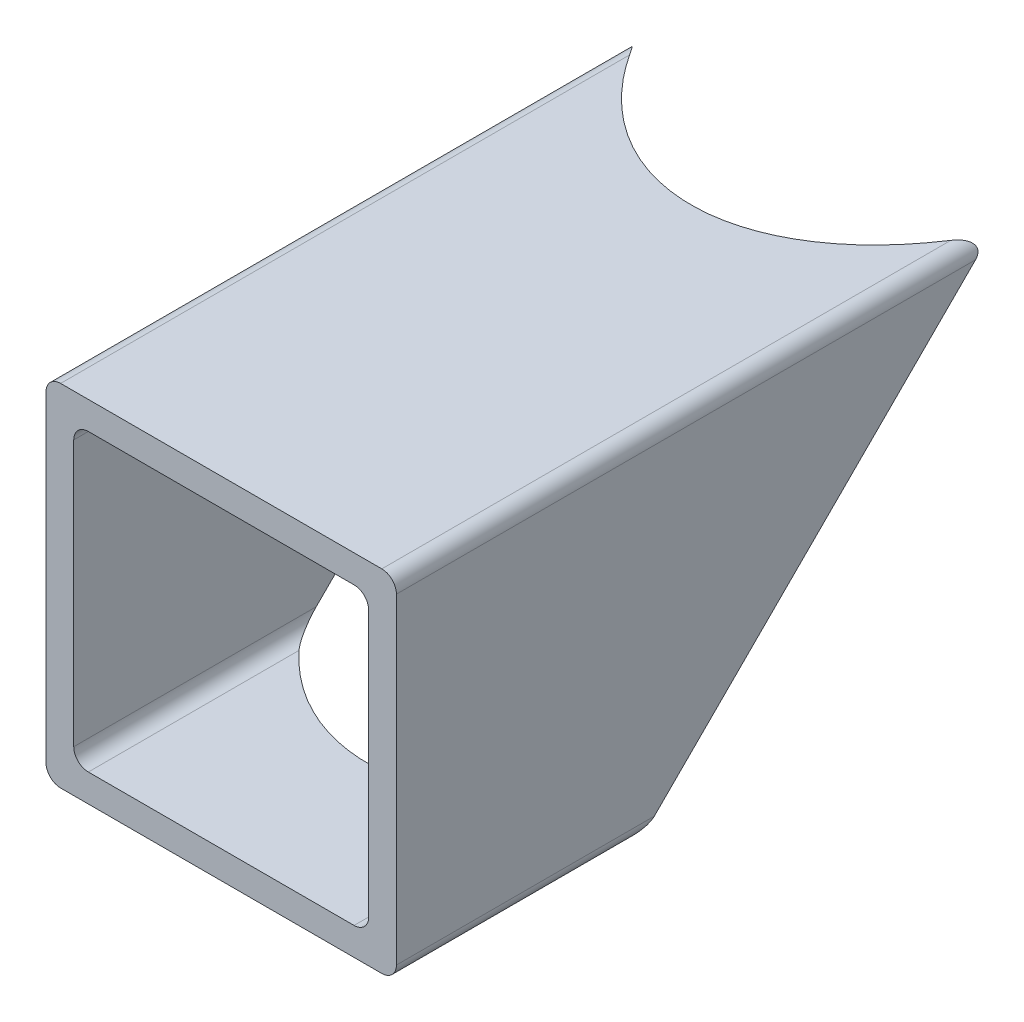
ISO-10303-21;
HEADER;
FILE_DESCRIPTION(('STEP AP214'),'2;1');
FILE_NAME('part.step','',(''),(''),'','','');
FILE_SCHEMA(('AUTOMOTIVE_DESIGN { 1 0 10303 214 1 1 1 1 }'));
ENDSEC;
DATA;
#1=APPLICATION_CONTEXT('core data for automotive mechanical design processes');
#2=APPLICATION_PROTOCOL_DEFINITION('international standard','automotive_design',2000,#1);
#3=PRODUCT_CONTEXT('',#1,'mechanical');
#4=PRODUCT('Part','Part','',(#3));
#5=PRODUCT_RELATED_PRODUCT_CATEGORY('part','',(#4));
#6=PRODUCT_DEFINITION_FORMATION('','',#4);
#7=PRODUCT_DEFINITION_CONTEXT('part definition',#1,'design');
#8=PRODUCT_DEFINITION('design','',#6,#7);
#9=PRODUCT_DEFINITION_SHAPE('','',#8);
#10=(LENGTH_UNIT() NAMED_UNIT(*) SI_UNIT(.MILLI.,.METRE.));
#11=(NAMED_UNIT(*) PLANE_ANGLE_UNIT() SI_UNIT($,.RADIAN.));
#12=(NAMED_UNIT(*) SI_UNIT($,.STERADIAN.) SOLID_ANGLE_UNIT());
#13=UNCERTAINTY_MEASURE_WITH_UNIT(LENGTH_MEASURE(1.E-05),#10,'distance_accuracy_value','');
#14=(GEOMETRIC_REPRESENTATION_CONTEXT(3) GLOBAL_UNCERTAINTY_ASSIGNED_CONTEXT((#13)) GLOBAL_UNIT_ASSIGNED_CONTEXT((#10,
#11,#12)) REPRESENTATION_CONTEXT('',''));
#15=CARTESIAN_POINT('',(0.,0.,0.));
#16=DIRECTION('',(0.,0.,1.));
#17=DIRECTION('',(1.,0.,0.));
#18=AXIS2_PLACEMENT_3D('',#15,#16,#17);
#19=CARTESIAN_POINT('',(-13.97,-13.97,50.8));
#20=DIRECTION('',(0.,0.,-1.));
#21=DIRECTION('',(-1.,0.,0.));
#22=AXIS2_PLACEMENT_3D('',#19,#20,#21);
#23=PLANE('',#22);
#24=CARTESIAN_POINT('',(-13.97,-13.97,50.8));
#25=DIRECTION('',(0.,0.,1.));
#26=DIRECTION('',(-1.,0.,0.));
#27=AXIS2_PLACEMENT_3D('',#24,#25,#26);
#28=CIRCLE('',#27,1.27);
#29=CARTESIAN_POINT('',(-15.24,-13.97,50.8));
#30=VERTEX_POINT('',#29);
#31=CARTESIAN_POINT('',(-13.97,-15.24,50.8));
#32=VERTEX_POINT('',#31);
#33=EDGE_CURVE('E210',#30,#32,#28,.T.);
#34=ORIENTED_EDGE('',*,*,#33,.T.);
#35=DIRECTION('',(1.,0.,0.));
#36=VECTOR('',#35,1.);
#37=CARTESIAN_POINT('',(-13.97,-15.24,50.8));
#38=LINE('',#37,#36);
#39=CARTESIAN_POINT('',(13.97,-15.24,50.8));
#40=VERTEX_POINT('',#39);
#41=EDGE_CURVE('E214',#32,#40,#38,.T.);
#42=ORIENTED_EDGE('',*,*,#41,.T.);
#43=CARTESIAN_POINT('',(13.97,-13.97,50.8));
#44=DIRECTION('',(0.,0.,1.));
#45=DIRECTION('',(1.,0.,0.));
#46=AXIS2_PLACEMENT_3D('',#43,#44,#45);
#47=CIRCLE('',#46,1.27);
#48=CARTESIAN_POINT('',(15.24,-13.97,50.8));
#49=VERTEX_POINT('',#48);
#50=EDGE_CURVE('E217',#40,#49,#47,.T.);
#51=ORIENTED_EDGE('',*,*,#50,.T.);
#52=DIRECTION('',(0.,1.,0.));
#53=VECTOR('',#52,1.);
#54=CARTESIAN_POINT('',(15.24,-13.97,50.8));
#55=LINE('',#54,#53);
#56=CARTESIAN_POINT('',(15.24,13.97,50.8));
#57=VERTEX_POINT('',#56);
#58=EDGE_CURVE('E220',#49,#57,#55,.T.);
#59=ORIENTED_EDGE('',*,*,#58,.T.);
#60=CARTESIAN_POINT('',(13.97,13.97,50.8));
#61=DIRECTION('',(0.,0.,1.));
#62=DIRECTION('',(-1.,0.,0.));
#63=AXIS2_PLACEMENT_3D('',#60,#61,#62);
#64=CIRCLE('',#63,1.27);
#65=CARTESIAN_POINT('',(13.97,15.24,50.8));
#66=VERTEX_POINT('',#65);
#67=EDGE_CURVE('E223',#57,#66,#64,.T.);
#68=ORIENTED_EDGE('',*,*,#67,.T.);
#69=DIRECTION('',(-1.,0.,0.));
#70=VECTOR('',#69,1.);
#71=CARTESIAN_POINT('',(-13.97,15.24,50.8));
#72=LINE('',#71,#70);
#73=CARTESIAN_POINT('',(-13.97,15.24,50.8));
#74=VERTEX_POINT('',#73);
#75=EDGE_CURVE('E226',#66,#74,#72,.T.);
#76=ORIENTED_EDGE('',*,*,#75,.T.);
#77=CARTESIAN_POINT('',(-13.97,13.97,50.8));
#78=DIRECTION('',(0.,0.,1.));
#79=DIRECTION('',(-1.,0.,0.));
#80=AXIS2_PLACEMENT_3D('',#77,#78,#79);
#81=CIRCLE('',#80,1.27);
#82=CARTESIAN_POINT('',(-15.24,13.97,50.8));
#83=VERTEX_POINT('',#82);
#84=EDGE_CURVE('E229',#74,#83,#81,.T.);
#85=ORIENTED_EDGE('',*,*,#84,.T.);
#86=DIRECTION('',(0.,-1.,0.));
#87=VECTOR('',#86,1.);
#88=CARTESIAN_POINT('',(-15.24,-13.97,50.8));
#89=LINE('',#88,#87);
#90=EDGE_CURVE('E232',#83,#30,#89,.T.);
#91=ORIENTED_EDGE('',*,*,#90,.T.);
#92=EDGE_LOOP('',(#34,#42,#51,#59,#68,#76,#85,#91));
#93=FACE_BOUND('',#92,.T.);
#94=CARTESIAN_POINT('',(-11.557,11.557,50.8));
#95=DIRECTION('',(0.,0.,1.));
#96=DIRECTION('',(-1.,0.,0.));
#97=AXIS2_PLACEMENT_3D('',#94,#95,#96);
#98=CIRCLE('',#97,1.27);
#99=CARTESIAN_POINT('',(-11.557,12.827,50.8));
#100=VERTEX_POINT('',#99);
#101=CARTESIAN_POINT('',(-12.827,11.557,50.8));
#102=VERTEX_POINT('',#101);
#103=EDGE_CURVE('E274',#100,#102,#98,.T.);
#104=ORIENTED_EDGE('',*,*,#103,.F.);
#105=DIRECTION('',(-1.,0.,0.));
#106=VECTOR('',#105,1.);
#107=CARTESIAN_POINT('',(-11.557,12.827,50.8));
#108=LINE('',#107,#106);
#109=CARTESIAN_POINT('',(11.557,12.827,50.8));
#110=VERTEX_POINT('',#109);
#111=EDGE_CURVE('E177',#110,#100,#108,.T.);
#112=ORIENTED_EDGE('',*,*,#111,.F.);
#113=CARTESIAN_POINT('',(11.557,11.557,50.8));
#114=DIRECTION('',(0.,0.,1.));
#115=DIRECTION('',(-1.,0.,0.));
#116=AXIS2_PLACEMENT_3D('',#113,#114,#115);
#117=CIRCLE('',#116,1.27);
#118=CARTESIAN_POINT('',(12.827,11.557,50.8));
#119=VERTEX_POINT('',#118);
#120=EDGE_CURVE('E185',#119,#110,#117,.T.);
#121=ORIENTED_EDGE('',*,*,#120,.F.);
#122=DIRECTION('',(0.,1.,0.));
#123=VECTOR('',#122,1.);
#124=CARTESIAN_POINT('',(12.827,-11.557,50.8));
#125=LINE('',#124,#123);
#126=CARTESIAN_POINT('',(12.827,-11.557,50.8));
#127=VERTEX_POINT('',#126);
#128=EDGE_CURVE('E430',#127,#119,#125,.T.);
#129=ORIENTED_EDGE('',*,*,#128,.F.);
#130=CARTESIAN_POINT('',(11.557,-11.557,50.8));
#131=DIRECTION('',(0.,0.,1.));
#132=DIRECTION('',(1.,0.,0.));
#133=AXIS2_PLACEMENT_3D('',#130,#131,#132);
#134=CIRCLE('',#133,1.27);
#135=CARTESIAN_POINT('',(11.557,-12.827,50.8));
#136=VERTEX_POINT('',#135);
#137=EDGE_CURVE('E433',#136,#127,#134,.T.);
#138=ORIENTED_EDGE('',*,*,#137,.F.);
#139=DIRECTION('',(1.,0.,0.));
#140=VECTOR('',#139,1.);
#141=CARTESIAN_POINT('',(-11.557,-12.827,50.8));
#142=LINE('',#141,#140);
#143=CARTESIAN_POINT('',(-11.557,-12.827,50.8));
#144=VERTEX_POINT('',#143);
#145=EDGE_CURVE('E437',#144,#136,#142,.T.);
#146=ORIENTED_EDGE('',*,*,#145,.F.);
#147=CARTESIAN_POINT('',(-11.557,-11.557,50.8));
#148=DIRECTION('',(0.,0.,1.));
#149=DIRECTION('',(-1.,0.,0.));
#150=AXIS2_PLACEMENT_3D('',#147,#148,#149);
#151=CIRCLE('',#150,1.27);
#152=CARTESIAN_POINT('',(-12.827,-11.557,50.8));
#153=VERTEX_POINT('',#152);
#154=EDGE_CURVE('E442',#153,#144,#151,.T.);
#155=ORIENTED_EDGE('',*,*,#154,.F.);
#156=DIRECTION('',(0.,-1.,0.));
#157=VECTOR('',#156,1.);
#158=CARTESIAN_POINT('',(-12.827,-11.557,50.8));
#159=LINE('',#158,#157);
#160=EDGE_CURVE('E278',#102,#153,#159,.T.);
#161=ORIENTED_EDGE('',*,*,#160,.F.);
#162=EDGE_LOOP('',(#104,#112,#121,#129,#138,#146,#155,#161));
#163=FACE_BOUND('',#162,.T.);
#164=ADVANCED_FACE('F45',(#93,#163),#23,.F.);
#165=CARTESIAN_POINT('',(-13.97,-13.97,50.8));
#166=DIRECTION('',(0.,0.,-1.));
#167=DIRECTION('',(-1.,0.,0.));
#168=AXIS2_PLACEMENT_3D('',#165,#166,#167);
#169=CYLINDRICAL_SURFACE('',#168,1.27);
#170=DIRECTION('',(0.,0.,-1.));
#171=VECTOR('',#170,1.);
#172=CARTESIAN_POINT('',(-15.24,-13.97,50.8));
#173=LINE('',#172,#171);
#174=CARTESIAN_POINT('',(-15.24,-13.97,28.3648451995282));
#175=VERTEX_POINT('',#174);
#176=EDGE_CURVE('E235',#30,#175,#173,.T.);
#177=ORIENTED_EDGE('',*,*,#176,.T.);
#178=CARTESIAN_POINT('',(-15.24,-13.97,28.3648451995282));
#179=CARTESIAN_POINT('',(-15.2399597933128,-14.0082625207357,28.4031806606299));
#180=CARTESIAN_POINT('',(-15.2382715238255,-14.04490144782,28.4430063442145));
#181=CARTESIAN_POINT('',(-15.2321714236056,-14.1152311687817,28.5248297774832));
#182=CARTESIAN_POINT('',(-15.2277663171047,-14.1489290075812,28.566821930692));
#183=CARTESIAN_POINT('',(-15.2168485300943,-14.2135691474092,28.6519821466976));
#184=CARTESIAN_POINT('',(-15.2103551137751,-14.2445334589871,28.6951362786126));
#185=CARTESIAN_POINT('',(-15.1955833749476,-14.3043568218791,28.7826268570673));
#186=CARTESIAN_POINT('',(-15.1873035662474,-14.3332140933194,28.8269642609535));
#187=CARTESIAN_POINT('',(-15.1580254222917,-14.4236944931634,28.9720369696088));
#188=CARTESIAN_POINT('',(-15.1339903259873,-14.4815605681103,29.0745107023465));
#189=CARTESIAN_POINT('',(-15.0801415732882,-14.5897767297412,29.2818613963164));
#190=CARTESIAN_POINT('',(-15.0503238387798,-14.6401214674997,29.3867400072517));
#191=CARTESIAN_POINT('',(-14.9855008644373,-14.7348416357365,29.5989306658683));
#192=CARTESIAN_POINT('',(-14.9504465766401,-14.7791521035202,29.7062565712552));
#193=CARTESIAN_POINT('',(-14.8758722505699,-14.8618479798902,29.9216421395505));
#194=CARTESIAN_POINT('',(-14.8363513837387,-14.9002322860284,30.0297019350909));
#195=CARTESIAN_POINT('',(-14.74734928766,-14.9762348883108,30.2608762247059));
#196=CARTESIAN_POINT('',(-14.6972453484167,-15.0130266093757,30.3840234940065));
#197=CARTESIAN_POINT('',(-14.5915148848506,-15.0792851324877,30.630006221175));
#198=CARTESIAN_POINT('',(-14.5358855246031,-15.1087481456037,30.7528414853907));
#199=CARTESIAN_POINT('',(-14.4192617860284,-15.1595723061417,30.9965113078229));
#200=CARTESIAN_POINT('',(-14.3583095096677,-15.1809909933737,31.1173539243881));
#201=CARTESIAN_POINT('',(-14.2301660321074,-15.2148346207996,31.3569060681196));
#202=CARTESIAN_POINT('',(-14.1629821125247,-15.2272699122726,31.475617896154));
#203=CARTESIAN_POINT('',(-14.0724476799731,-15.2360152718066,31.6251205591627));
#204=CARTESIAN_POINT('',(-14.0523892316306,-15.2374882363207,31.657636677661));
#205=CARTESIAN_POINT('',(-14.0116584410891,-15.2394808563908,31.7223627340123));
#206=CARTESIAN_POINT('',(-13.9909854269929,-15.2399994264151,31.7545722818153));
#207=CARTESIAN_POINT('',(-13.97,-15.24,31.7865846609608));
#208=B_SPLINE_CURVE_WITH_KNOTS('',3,(#178,#179,#180,#181,#182,#183,#184,#185,#186,#187,#188,
#189,#190,#191,#192,#193,#194,#195,#196,#197,#198,#199,#200,#201,#202,#203,#204,#205,#206,#207),
.UNSPECIFIED.,.F.,.F.,(4,2,2,2,2,2,2,2,2,2,2,2,2,2,4),(0.,0.162287984781081,0.324175906209731,
0.484611336670431,0.645180759888944,1.00492153309957,1.36491693646875,1.72852442534908,
2.09219947509691,2.50573656284833,2.91948700635604,3.33021889048948,3.74047674326324,
3.85516316641701,3.96997995387947),.UNSPECIFIED.);
#209=CARTESIAN_POINT('',(-13.97,-15.24,31.7865846609609));
#210=VERTEX_POINT('',#209);
#211=EDGE_CURVE('E62',#175,#210,#208,.T.);
#212=ORIENTED_EDGE('',*,*,#211,.T.);
#213=DIRECTION('',(0.,0.,-1.));
#214=VECTOR('',#213,1.);
#215=CARTESIAN_POINT('',(-13.97,-15.24,50.8));
#216=LINE('',#215,#214);
#217=EDGE_CURVE('E55',#32,#210,#216,.T.);
#218=ORIENTED_EDGE('',*,*,#217,.F.);
#219=ORIENTED_EDGE('',*,*,#33,.F.);
#220=EDGE_LOOP('',(#177,#212,#218,#219));
#221=FACE_BOUND('',#220,.T.);
#222=ADVANCED_FACE('F47',(#221),#169,.T.);
#223=CARTESIAN_POINT('',(-13.97,-15.24,50.8));
#224=DIRECTION('',(0.,1.,0.));
#225=DIRECTION('',(0.,0.,1.));
#226=AXIS2_PLACEMENT_3D('',#223,#224,#225);
#227=PLANE('',#226);
#228=ORIENTED_EDGE('',*,*,#217,.T.);
#229=CARTESIAN_POINT('',(0.,-15.24,13.4703841816037));
#230=DIRECTION('',(0.,1.,0.));
#231=DIRECTION('',(0.,0.,-1.));
#232=AXIS2_PLACEMENT_3D('',#229,#230,#231);
#233=ELLIPSE('',#232,26.9407683632075,19.05);
#234=CARTESIAN_POINT('',(13.97,-15.24,31.7865846609608));
#235=VERTEX_POINT('',#234);
#236=EDGE_CURVE('E269',#210,#235,#233,.T.);
#237=ORIENTED_EDGE('',*,*,#236,.T.);
#238=DIRECTION('',(0.,0.,-1.));
#239=VECTOR('',#238,1.);
#240=CARTESIAN_POINT('',(13.97,-15.24,50.8));
#241=LINE('',#240,#239);
#242=EDGE_CURVE('E259',#40,#235,#241,.T.);
#243=ORIENTED_EDGE('',*,*,#242,.F.);
#244=ORIENTED_EDGE('',*,*,#41,.F.);
#245=EDGE_LOOP('',(#228,#237,#243,#244));
#246=FACE_BOUND('',#245,.T.);
#247=ADVANCED_FACE('F267',(#246),#227,.F.);
#248=CARTESIAN_POINT('',(13.97,-13.97,50.8));
#249=DIRECTION('',(0.,0.,-1.));
#250=DIRECTION('',(-1.,0.,0.));
#251=AXIS2_PLACEMENT_3D('',#248,#249,#250);
#252=CYLINDRICAL_SURFACE('',#251,1.27);
#253=ORIENTED_EDGE('',*,*,#242,.T.);
#254=CARTESIAN_POINT('',(13.97,-15.24,31.7865846609608));
#255=CARTESIAN_POINT('',(14.0065290762244,-15.2399806952168,31.730840496028));
#256=CARTESIAN_POINT('',(14.0421254939304,-15.2384241832387,31.6745138504665));
#257=CARTESIAN_POINT('',(14.1115614412475,-15.2325712509416,31.5609663396746));
#258=CARTESIAN_POINT('',(14.1454019238778,-15.2282763340509,31.5037459819117));
#259=CARTESIAN_POINT('',(14.2114183950377,-15.2172896373316,31.3887173865096));
#260=CARTESIAN_POINT('',(14.2435970998793,-15.2106019204198,31.3309103057987));
#261=CARTESIAN_POINT('',(14.3064518111961,-15.1950501893631,31.2147676476418));
#262=CARTESIAN_POINT('',(14.3371275682752,-15.1861858154854,31.1564319843742));
#263=CARTESIAN_POINT('',(14.4283687304961,-15.1561572045208,30.9782093373603));
#264=CARTESIAN_POINT('',(14.4866795449666,-15.1318180144499,30.8576886081662));
#265=CARTESIAN_POINT('',(14.5978326083327,-15.0757119029625,30.615814823344));
#266=CARTESIAN_POINT('',(14.6506718427174,-15.0439409181559,30.4944613477654));
#267=CARTESIAN_POINT('',(14.752837688537,-14.9720515763253,30.247256385929));
#268=CARTESIAN_POINT('',(14.8019704384879,-14.9316747790258,30.121399625895));
#269=CARTESIAN_POINT('',(14.8944219339882,-14.8431783035134,29.8702369894594));
#270=CARTESIAN_POINT('',(14.9377393887235,-14.7950569114372,29.7449312413158));
#271=CARTESIAN_POINT('',(15.0175588176793,-14.6909616547963,29.4972040190317));
#272=CARTESIAN_POINT('',(15.0541342633878,-14.6350857258766,29.374765949615));
#273=CARTESIAN_POINT('',(15.103404208826,-14.5440004585481,29.1933010921417));
#274=CARTESIAN_POINT('',(15.1188923849296,-14.5124349456899,29.1331918262324));
#275=CARTESIAN_POINT('',(15.1477402046985,-14.4465747657175,29.0139739134378));
#276=CARTESIAN_POINT('',(15.1611005058341,-14.4122809465246,28.9548649625401));
#277=CARTESIAN_POINT('',(15.182961351408,-14.3475612684423,28.8494202055626));
#278=CARTESIAN_POINT('',(15.1919015651048,-14.3176840325198,28.8028400139231));
#279=CARTESIAN_POINT('',(15.2078686859214,-14.2556644661392,28.7109310549519));
#280=CARTESIAN_POINT('',(15.2148973845535,-14.2235242923754,28.6656011518851));
#281=CARTESIAN_POINT('',(15.2267165830087,-14.1563935902849,28.5762622055116));
#282=CARTESIAN_POINT('',(15.2314913196524,-14.1213849401966,28.5322644217688));
#283=CARTESIAN_POINT('',(15.2381133607929,-14.0481798717443,28.4465831104398));
#284=CARTESIAN_POINT('',(15.2399526335068,-14.0099750073185,28.4049062324095));
#285=CARTESIAN_POINT('',(15.2400000000004,-13.9700000000005,28.364845199528));
#286=B_SPLINE_CURVE_WITH_KNOTS('',3,(#254,#255,#256,#257,#258,#259,#260,#261,#262,#263,#264,
#265,#266,#267,#268,#269,#270,#271,#272,#273,#274,#275,#276,#277,#278,#279,#280,#281,#282,#283,
#284,#285),.UNSPECIFIED.,.F.,.F.,(4,2,2,2,2,2,2,2,2,2,2,2,2,2,2,4),(0.,0.199878931316031,
0.399648220267438,0.599079903128122,0.798544567970603,1.20639488593044,1.61446872253378,
2.03717333516017,2.45997162043096,2.87784792501179,3.08668952134157,3.29546646413904,
3.4635571090219,3.63148966861092,3.80057988206464,3.97013195840712),.UNSPECIFIED.);
#287=CARTESIAN_POINT('',(15.24,-13.97,28.3648451995282));
#288=VERTEX_POINT('',#287);
#289=EDGE_CURVE('E280',#235,#288,#286,.T.);
#290=ORIENTED_EDGE('',*,*,#289,.T.);
#291=DIRECTION('',(0.,0.,-1.));
#292=VECTOR('',#291,1.);
#293=CARTESIAN_POINT('',(15.24,-13.97,50.8));
#294=LINE('',#293,#292);
#295=EDGE_CURVE('E255',#49,#288,#294,.T.);
#296=ORIENTED_EDGE('',*,*,#295,.F.);
#297=ORIENTED_EDGE('',*,*,#50,.F.);
#298=EDGE_LOOP('',(#253,#290,#296,#297));
#299=FACE_BOUND('',#298,.T.);
#300=ADVANCED_FACE('F352',(#299),#252,.T.);
#301=CARTESIAN_POINT('',(15.24,-13.97,50.8));
#302=DIRECTION('',(-1.,0.,0.));
#303=DIRECTION('',(0.,0.,1.));
#304=AXIS2_PLACEMENT_3D('',#301,#302,#303);
#305=PLANE('',#304);
#306=ORIENTED_EDGE('',*,*,#295,.T.);
#307=DIRECTION('',(0.,0.707106781186546,-0.707106781186549));
#308=VECTOR('',#307,1.);
#309=CARTESIAN_POINT('',(15.24,-25.8225774002359,40.2174225997642));
#310=LINE('',#309,#308);
#311=CARTESIAN_POINT('',(15.24,13.97,0.424845199528151));
#312=VERTEX_POINT('',#311);
#313=EDGE_CURVE('E351',#288,#312,#310,.T.);
#314=ORIENTED_EDGE('',*,*,#313,.T.);
#315=DIRECTION('',(0.,0.,-1.));
#316=VECTOR('',#315,1.);
#317=CARTESIAN_POINT('',(15.24,13.97,50.8));
#318=LINE('',#317,#316);
#319=EDGE_CURVE('E251',#57,#312,#318,.T.);
#320=ORIENTED_EDGE('',*,*,#319,.F.);
#321=ORIENTED_EDGE('',*,*,#58,.F.);
#322=EDGE_LOOP('',(#306,#314,#320,#321));
#323=FACE_BOUND('',#322,.T.);
#324=ADVANCED_FACE('F356',(#323),#305,.F.);
#325=CARTESIAN_POINT('',(13.97,13.97,50.8));
#326=DIRECTION('',(0.,0.,-1.));
#327=DIRECTION('',(-1.,0.,0.));
#328=AXIS2_PLACEMENT_3D('',#325,#326,#327);
#329=CYLINDRICAL_SURFACE('',#328,1.27);
#330=ORIENTED_EDGE('',*,*,#319,.T.);
#331=CARTESIAN_POINT('',(15.24,13.97,0.424845199528151));
#332=CARTESIAN_POINT('',(15.2399676772554,14.0030580280685,0.391840589170646));
#333=CARTESIAN_POINT('',(15.2387055541065,14.0374035921171,0.359881383859996));
#334=CARTESIAN_POINT('',(15.2328553173673,14.1094806076604,0.298831717975095));
#335=CARTESIAN_POINT('',(15.2281995856808,14.1472670154024,0.26981345374826));
#336=CARTESIAN_POINT('',(15.2145746481415,14.2260009565652,0.216683739828067));
#337=CARTESIAN_POINT('',(15.2055714859659,14.2669712076474,0.192613080736757));
#338=CARTESIAN_POINT('',(15.1823064912551,14.3508885445766,0.152199228998776));
#339=CARTESIAN_POINT('',(15.1680919216372,14.3938149172998,0.135789508571399));
#340=CARTESIAN_POINT('',(15.1394183860338,14.4663524008863,0.116454880243763));
#341=CARTESIAN_POINT('',(15.1264700611795,14.4958636684764,0.110902704493998));
#342=CARTESIAN_POINT('',(15.0980984452387,14.5542474687677,0.104798604378286));
#343=CARTESIAN_POINT('',(15.0826736688606,14.5831196062405,0.104249692286439));
#344=CARTESIAN_POINT('',(15.049836757142,14.6392602246224,0.108122992540109));
#345=CARTESIAN_POINT('',(15.0324289453603,14.6665320051131,0.112534569262359));
#346=CARTESIAN_POINT('',(14.9961677411691,14.7189312024157,0.125803651610084));
#347=CARTESIAN_POINT('',(14.9773134920687,14.7440573295004,0.134663809520228));
#348=CARTESIAN_POINT('',(14.9305029741956,14.8020147895149,0.160646021218692));
#349=CARTESIAN_POINT('',(14.9020740384156,14.8336018883234,0.179677952231376));
#350=CARTESIAN_POINT('',(14.8444493231867,14.8919157902864,0.223193616150866));
#351=CARTESIAN_POINT('',(14.8152519654721,14.9186315229998,0.247689492300282));
#352=CARTESIAN_POINT('',(14.7375767621054,14.9837689767054,0.317772240889159));
#353=CARTESIAN_POINT('',(14.6889730113795,15.0184253740807,0.366678034812447));
#354=CARTESIAN_POINT('',(14.5923432547486,15.0785333163203,0.470730769121807));
#355=CARTESIAN_POINT('',(14.5443233269007,15.1039214337015,0.525917444880577));
#356=CARTESIAN_POINT('',(14.4498748504733,15.1469802405767,0.639534565912577));
#357=CARTESIAN_POINT('',(14.4034359558244,15.1647174707145,0.697931847912596));
#358=CARTESIAN_POINT('',(14.3117409856235,15.1941047028279,0.81724952996219));
#359=CARTESIAN_POINT('',(14.2664870707712,15.2057442332985,0.878174077744335));
#360=CARTESIAN_POINT('',(14.1785887906798,15.2235327713959,0.999869780810549));
#361=CARTESIAN_POINT('',(14.1359068248215,15.2298335294287,1.06059250654504));
#362=CARTESIAN_POINT('',(14.0519447370921,15.2380449842418,1.18295318399597));
#363=CARTESIAN_POINT('',(14.0106598427039,15.2399725220264,1.24458670162347));
#364=CARTESIAN_POINT('',(13.97,15.24,1.30658466096074));
#365=B_SPLINE_CURVE_WITH_KNOTS('',3,(#331,#332,#333,#334,#335,#336,#337,#338,#339,#340,#341,
#342,#343,#344,#345,#346,#347,#348,#349,#350,#351,#352,#353,#354,#355,#356,#357,#358,#359,#360,
#361,#362,#363,#364),.UNSPECIFIED.,.F.,.F.,(4,2,2,2,2,2,2,2,2,2,2,2,2,2,2,2,4),(0.,
0.140361710208743,0.283599365072397,0.427974355704216,0.571071133781769,0.668732711808757,
0.766453084263708,0.863964336483189,0.961533794958897,1.10043082715706,1.23963967979582,
1.46985692820807,1.7016213757146,1.93132737700642,2.16142656710745,2.38474217618494,
2.60719634014283),.UNSPECIFIED.);
#366=CARTESIAN_POINT('',(13.97,15.24,1.30658466096074));
#367=VERTEX_POINT('',#366);
#368=EDGE_CURVE('E337',#312,#367,#365,.T.);
#369=ORIENTED_EDGE('',*,*,#368,.T.);
#370=DIRECTION('',(0.,0.,-1.));
#371=VECTOR('',#370,1.);
#372=CARTESIAN_POINT('',(13.97,15.24,50.8));
#373=LINE('',#372,#371);
#374=EDGE_CURVE('E247',#66,#367,#373,.T.);
#375=ORIENTED_EDGE('',*,*,#374,.F.);
#376=ORIENTED_EDGE('',*,*,#67,.F.);
#377=EDGE_LOOP('',(#330,#369,#375,#376));
#378=FACE_BOUND('',#377,.T.);
#379=ADVANCED_FACE('F381',(#378),#329,.T.);
#380=CARTESIAN_POINT('',(-13.97,15.24,50.8));
#381=DIRECTION('',(0.,-1.,0.));
#382=DIRECTION('',(0.,0.,-1.));
#383=AXIS2_PLACEMENT_3D('',#380,#381,#382);
#384=PLANE('',#383);
#385=ORIENTED_EDGE('',*,*,#374,.T.);
#386=CARTESIAN_POINT('',(0.,15.24,-17.0096158183964));
#387=DIRECTION('',(0.,-1.,0.));
#388=DIRECTION('',(0.,0.,-1.));
#389=AXIS2_PLACEMENT_3D('',#386,#387,#388);
#390=ELLIPSE('',#389,26.9407683632075,19.05);
#391=CARTESIAN_POINT('',(-13.97,15.24,1.30658466096074));
#392=VERTEX_POINT('',#391);
#393=EDGE_CURVE('E399',#367,#392,#390,.T.);
#394=ORIENTED_EDGE('',*,*,#393,.T.);
#395=DIRECTION('',(0.,0.,-1.));
#396=VECTOR('',#395,1.);
#397=CARTESIAN_POINT('',(-13.97,15.24,50.8));
#398=LINE('',#397,#396);
#399=EDGE_CURVE('E243',#74,#392,#398,.T.);
#400=ORIENTED_EDGE('',*,*,#399,.F.);
#401=ORIENTED_EDGE('',*,*,#75,.F.);
#402=EDGE_LOOP('',(#385,#394,#400,#401));
#403=FACE_BOUND('',#402,.T.);
#404=ADVANCED_FACE('F378',(#403),#384,.F.);
#405=CARTESIAN_POINT('',(-13.97,13.97,50.8));
#406=DIRECTION('',(0.,0.,-1.));
#407=DIRECTION('',(-1.,0.,0.));
#408=AXIS2_PLACEMENT_3D('',#405,#406,#407);
#409=CYLINDRICAL_SURFACE('',#408,1.27);
#410=ORIENTED_EDGE('',*,*,#399,.T.);
#411=CARTESIAN_POINT('',(-13.97,15.24,1.30658466096074));
#412=CARTESIAN_POINT('',(-14.010606573071,15.2399724103742,1.24466810060632));
#413=CARTESIAN_POINT('',(-14.0518373197152,15.2380499313477,1.18311362349118));
#414=CARTESIAN_POINT('',(-14.1356825938392,15.229861076719,1.06091533324922));
#415=CARTESIAN_POINT('',(-14.1783017304395,15.2235784395484,1.00027580040243));
#416=CARTESIAN_POINT('',(-14.2651412827038,15.2060290038644,0.880028759668117));
#417=CARTESIAN_POINT('',(-14.3093726164012,15.1947180975426,0.820435347007667));
#418=CARTESIAN_POINT('',(-14.3989732044248,15.1662826644947,0.703642558038937));
#419=CARTESIAN_POINT('',(-14.4443403990702,15.1491680417418,0.646439288539094));
#420=CARTESIAN_POINT('',(-14.5252767357607,15.1128208588427,0.54867038889303));
#421=CARTESIAN_POINT('',(-14.560617319065,15.0950537163192,0.507376897557245));
#422=CARTESIAN_POINT('',(-14.6318428903073,15.0546845994737,0.42764098841986));
#423=CARTESIAN_POINT('',(-14.6677279893638,15.03208162564,0.389199162240658));
#424=CARTESIAN_POINT('',(-14.7401741618271,14.9808061314824,0.316097911585215));
#425=CARTESIAN_POINT('',(-14.7767382413117,14.9520660169518,0.281487728768367));
#426=CARTESIAN_POINT('',(-14.8493916305855,14.8875566213489,0.218926850924971));
#427=CARTESIAN_POINT('',(-14.8854821405649,14.8518118499361,0.190953666395387));
#428=CARTESIAN_POINT('',(-14.9419761963466,14.7880489701111,0.15407042739019));
#429=CARTESIAN_POINT('',(-14.9630128145163,14.7624469261322,0.141979476095539));
#430=CARTESIAN_POINT('',(-15.0037505843002,14.7085103343667,0.122539481452712));
#431=CARTESIAN_POINT('',(-15.0234531499865,14.6801787595628,0.115185344452036));
#432=CARTESIAN_POINT('',(-15.0609589176606,14.62110626426,0.106002446884601));
#433=CARTESIAN_POINT('',(-15.0787471296574,14.5903491972283,0.104214605774266));
#434=CARTESIAN_POINT('',(-15.1115785491434,14.5276297242896,0.106621186937798));
#435=CARTESIAN_POINT('',(-15.1266220754435,14.4956674588944,0.110814913918909));
#436=CARTESIAN_POINT('',(-15.1524227802501,14.4345233376837,0.124179661418141));
#437=CARTESIAN_POINT('',(-15.1634408406127,14.4053446353657,0.132879574285392));
#438=CARTESIAN_POINT('',(-15.1829435725077,14.3476215747677,0.1542704252313));
#439=CARTESIAN_POINT('',(-15.1914264647457,14.3190776749648,0.166964153581849));
#440=CARTESIAN_POINT('',(-15.2103456595707,14.2466739598637,0.203960870476029));
#441=CARTESIAN_POINT('',(-15.2190257181214,14.2036135442445,0.230712817565027));
#442=CARTESIAN_POINT('',(-15.2317279705319,14.1207248502111,0.289713192738764));
#443=CARTESIAN_POINT('',(-15.2357379768709,14.0809052799606,0.321975751785271));
#444=CARTESIAN_POINT('',(-15.2393388933818,14.0177835597796,0.378307472771017));
#445=CARTESIAN_POINT('',(-15.2399845078742,13.9935729165146,0.401298872071941));
#446=CARTESIAN_POINT('',(-15.2400000000003,13.9699999999999,0.424845199528012));
#447=B_SPLINE_CURVE_WITH_KNOTS('',3,(#411,#412,#413,#414,#415,#416,#417,#418,#419,#420,#421,
#422,#423,#424,#425,#426,#427,#428,#429,#430,#431,#432,#433,#434,#435,#436,#437,#438,#439,#440,
#441,#442,#443,#444,#445,#446),.UNSPECIFIED.,.F.,.F.,(4,2,2,2,2,2,2,2,2,2,2,2,2,2,2,2,2,4),(0.,
0.222165514494975,0.445164097902904,0.670158647692716,0.894771163122025,1.0661032098459,
1.23747070323521,1.41083313538863,1.58359945919306,1.68904967760299,1.79438631176568,
1.90049549947464,2.00659235414048,2.1033409990859,2.20015738795366,2.35356192218193,
2.50736590822369,2.60741031039654),.UNSPECIFIED.);
#448=CARTESIAN_POINT('',(-15.24,13.97,0.424845199528158));
#449=VERTEX_POINT('',#448);
#450=EDGE_CURVE('E329',#392,#449,#447,.T.);
#451=ORIENTED_EDGE('',*,*,#450,.T.);
#452=DIRECTION('',(0.,0.,-1.));
#453=VECTOR('',#452,1.);
#454=CARTESIAN_POINT('',(-15.24,13.97,50.8));
#455=LINE('',#454,#453);
#456=EDGE_CURVE('E239',#83,#449,#455,.T.);
#457=ORIENTED_EDGE('',*,*,#456,.F.);
#458=ORIENTED_EDGE('',*,*,#84,.F.);
#459=EDGE_LOOP('',(#410,#451,#457,#458));
#460=FACE_BOUND('',#459,.T.);
#461=ADVANCED_FACE('F373',(#460),#409,.T.);
#462=CARTESIAN_POINT('',(-15.24,-13.97,50.8));
#463=DIRECTION('',(1.,0.,0.));
#464=DIRECTION('',(0.,0.,-1.));
#465=AXIS2_PLACEMENT_3D('',#462,#463,#464);
#466=PLANE('',#465);
#467=ORIENTED_EDGE('',*,*,#456,.T.);
#468=DIRECTION('',(0.,0.707106781186546,-0.707106781186549));
#469=VECTOR('',#468,1.);
#470=CARTESIAN_POINT('',(-15.24,-25.8225774002359,40.2174225997642));
#471=LINE('',#470,#469);
#472=EDGE_CURVE('E172',#449,#175,#471,.F.);
#473=ORIENTED_EDGE('',*,*,#472,.T.);
#474=ORIENTED_EDGE('',*,*,#176,.F.);
#475=ORIENTED_EDGE('',*,*,#90,.F.);
#476=EDGE_LOOP('',(#467,#473,#474,#475));
#477=FACE_BOUND('',#476,.T.);
#478=ADVANCED_FACE('F371',(#477),#466,.F.);
#479=CARTESIAN_POINT('',(-11.557,11.557,50.8));
#480=DIRECTION('',(0.,0.,-1.));
#481=DIRECTION('',(-1.,0.,0.));
#482=AXIS2_PLACEMENT_3D('',#479,#480,#481);
#483=CYLINDRICAL_SURFACE('',#482,1.27);
#484=CARTESIAN_POINT('',(-11.557,12.827,6.82011833973339));
#485=CARTESIAN_POINT('',(-11.5932136083091,12.826984932894,6.78104987232148));
#486=CARTESIAN_POINT('',(-11.6300668418927,12.8254494723392,6.74252081029094));
#487=CARTESIAN_POINT('',(-11.7051476618477,12.818899173073,6.66680357743243));
#488=CARTESIAN_POINT('',(-11.7433805932227,12.8138690174138,6.62962207058629));
#489=CARTESIAN_POINT('',(-11.8216066901763,12.7997731121831,6.55664385444182));
#490=CARTESIAN_POINT('',(-11.8616180987675,12.7906450255148,6.52087819505438));
#491=CARTESIAN_POINT('',(-11.9425865318925,12.7677807919584,6.45211544908202));
#492=CARTESIAN_POINT('',(-11.9835415377978,12.7540537604142,6.41911304605733));
#493=CARTESIAN_POINT('',(-12.064928802512,12.7218029235567,6.35768964077335));
#494=CARTESIAN_POINT('',(-12.1053400079738,12.7034350158393,6.32916106540683));
#495=CARTESIAN_POINT('',(-12.1861931663414,12.6611239487514,6.27684033685985));
#496=CARTESIAN_POINT('',(-12.2266346898639,12.6371971197457,6.25303468181728));
#497=CARTESIAN_POINT('',(-12.3073223362355,12.5828233997058,6.21137027803134));
#498=CARTESIAN_POINT('',(-12.3475569839027,12.552286408324,6.19360343730172));
#499=CARTESIAN_POINT('',(-12.4255798591046,12.4849569474563,6.16649912613175));
#500=CARTESIAN_POINT('',(-12.4633727660247,12.4481769646036,6.15714506000865));
#501=CARTESIAN_POINT('',(-12.5293692898825,12.3752047669419,6.14897370555668));
#502=CARTESIAN_POINT('',(-12.5581687526988,12.3397006638789,6.14882522343289));
#503=CARTESIAN_POINT('',(-12.611456388753,12.2662796571489,6.15593118211797));
#504=CARTESIAN_POINT('',(-12.6359443500552,12.2283626349973,6.16318598672288));
#505=CARTESIAN_POINT('',(-12.6773588257739,12.1563429382054,6.18313118507994));
#506=CARTESIAN_POINT('',(-12.6948430553463,12.1223382375349,6.19505182641053));
#507=CARTESIAN_POINT('',(-12.7261036522456,12.0544867192645,6.22330246364111));
#508=CARTESIAN_POINT('',(-12.7398791259494,12.0206399416433,6.23963352033337));
#509=CARTESIAN_POINT('',(-12.7710930240158,11.9339350200449,6.28656498354272));
#510=CARTESIAN_POINT('',(-12.785909315656,11.8816223512422,6.31990420951766));
#511=CARTESIAN_POINT('',(-12.8083870725634,11.7798536007668,6.39284438780804));
#512=CARTESIAN_POINT('',(-12.8160256832038,11.7304071111299,6.43246487558945));
#513=CARTESIAN_POINT('',(-12.8229255228324,11.6609375247627,6.49305505550834));
#514=CARTESIAN_POINT('',(-12.8244836471498,11.6396273100603,6.51235927392986));
#515=CARTESIAN_POINT('',(-12.8265167701614,11.5977781434179,6.55159041856254));
#516=CARTESIAN_POINT('',(-12.8269983433561,11.57723526753,6.57151280743948));
#517=CARTESIAN_POINT('',(-12.827,11.557,6.59174611224446));
#518=B_SPLINE_CURVE_WITH_KNOTS('',3,(#484,#485,#486,#487,#488,#489,#490,#491,#492,#493,#494,
#495,#496,#497,#498,#499,#500,#501,#502,#503,#504,#505,#506,#507,#508,#509,#510,#511,#512,#513,
#514,#515,#516,#517),.UNSPECIFIED.,.F.,.F.,(4,2,2,2,2,2,2,2,2,2,2,2,2,2,2,2,4),(0.,
0.159843065618974,0.320391166078133,0.483468904770448,0.646225308678531,0.804109445461936,
0.961535505368962,1.12126019357286,1.280669101102,1.41696310061867,1.55326379791822,
1.67296172872624,1.79268847493779,1.98294008269294,2.17379544261096,2.26015521288622,
2.34598612614598),.UNSPECIFIED.);
#519=CARTESIAN_POINT('',(-11.557,12.827,6.82011833973341));
#520=VERTEX_POINT('',#519);
#521=CARTESIAN_POINT('',(-12.827,11.557,6.59174611224447));
#522=VERTEX_POINT('',#521);
#523=EDGE_CURVE('E158',#520,#522,#518,.T.);
#524=ORIENTED_EDGE('',*,*,#523,.F.);
#525=DIRECTION('',(0.,0.,-1.));
#526=VECTOR('',#525,1.);
#527=CARTESIAN_POINT('',(-11.557,12.827,50.8));
#528=LINE('',#527,#526);
#529=EDGE_CURVE('E167',#100,#520,#528,.T.);
#530=ORIENTED_EDGE('',*,*,#529,.F.);
#531=ORIENTED_EDGE('',*,*,#103,.T.);
#532=DIRECTION('',(0.,0.,-1.));
#533=VECTOR('',#532,1.);
#534=CARTESIAN_POINT('',(-12.827,11.557,50.8));
#535=LINE('',#534,#533);
#536=EDGE_CURVE('E170',#102,#522,#535,.T.);
#537=ORIENTED_EDGE('',*,*,#536,.T.);
#538=EDGE_LOOP('',(#524,#530,#531,#537));
#539=FACE_BOUND('',#538,.T.);
#540=ADVANCED_FACE('F166',(#539),#483,.F.);
#541=CARTESIAN_POINT('',(-12.827,-11.557,50.8));
#542=DIRECTION('',(1.,0.,0.));
#543=DIRECTION('',(0.,0.,-1.));
#544=AXIS2_PLACEMENT_3D('',#541,#542,#543);
#545=PLANE('',#544);
#546=DIRECTION('',(0.,0.707106781186546,-0.707106781186549));
#547=VECTOR('',#546,1.);
#548=CARTESIAN_POINT('',(-12.827,-23.9456269438777,42.0943730561223));
#549=LINE('',#548,#547);
#550=CARTESIAN_POINT('',(-12.827,-11.557,29.7057461122445));
#551=VERTEX_POINT('',#550);
#552=EDGE_CURVE('E173',#522,#551,#549,.F.);
#553=ORIENTED_EDGE('',*,*,#552,.F.);
#554=ORIENTED_EDGE('',*,*,#536,.F.);
#555=ORIENTED_EDGE('',*,*,#160,.T.);
#556=DIRECTION('',(0.,0.,-1.));
#557=VECTOR('',#556,1.);
#558=CARTESIAN_POINT('',(-12.827,-11.557,50.8));
#559=LINE('',#558,#557);
#560=EDGE_CURVE('E204',#153,#551,#559,.T.);
#561=ORIENTED_EDGE('',*,*,#560,.T.);
#562=EDGE_LOOP('',(#553,#554,#555,#561));
#563=FACE_BOUND('',#562,.T.);
#564=ADVANCED_FACE('F448',(#563),#545,.T.);
#565=CARTESIAN_POINT('',(-11.557,-11.557,50.8));
#566=DIRECTION('',(0.,0.,-1.));
#567=DIRECTION('',(-1.,0.,0.));
#568=AXIS2_PLACEMENT_3D('',#565,#566,#567);
#569=CYLINDRICAL_SURFACE('',#568,1.27);
#570=CARTESIAN_POINT('',(-12.827,-11.557,29.7057461122445));
#571=CARTESIAN_POINT('',(-12.826996161394,-11.5817685571386,29.7305192332047));
#572=CARTESIAN_POINT('',(-12.8262757797432,-11.6060657515998,29.7557446706357));
#573=CARTESIAN_POINT('',(-12.8235354848245,-11.6537465568804,29.8069539692105));
#574=CARTESIAN_POINT('',(-12.8215162421094,-11.6771306325048,29.8329374324103));
#575=CARTESIAN_POINT('',(-12.8137227508646,-11.7458742603346,29.9117072330365));
#576=CARTESIAN_POINT('',(-12.8062113108921,-11.7899543310126,29.9654439714911));
#577=CARTESIAN_POINT('',(-12.7873420079158,-11.8748771766644,30.074565040041));
#578=CARTESIAN_POINT('',(-12.7759912767281,-11.9157257820149,30.1299461428359));
#579=CARTESIAN_POINT('',(-12.7499616643183,-11.9945675140299,30.2420086687077));
#580=CARTESIAN_POINT('',(-12.7352796755571,-12.0325579301089,30.2986912612101));
#581=CARTESIAN_POINT('',(-12.6925713781495,-12.1294719406294,30.44977423278));
#582=CARTESIAN_POINT('',(-12.662042858057,-12.1861085370338,30.5449414639258));
#583=CARTESIAN_POINT('',(-12.5941379613599,-12.2926849771221,30.7365422922358));
#584=CARTESIAN_POINT('',(-12.5567603782632,-12.3426236382471,30.832976109732));
#585=CARTESIAN_POINT('',(-12.4755565847859,-12.4362067047449,31.0266449378973));
#586=CARTESIAN_POINT('',(-12.4317086098718,-12.4798288416564,31.1238815640345));
#587=CARTESIAN_POINT('',(-12.3378535824758,-12.5604924781519,31.3181115974889));
#588=CARTESIAN_POINT('',(-12.2878470350396,-12.5975345167418,31.4151050240853));
#589=CARTESIAN_POINT('',(-12.1884279952671,-12.660264194421,31.5956414660237));
#590=CARTESIAN_POINT('',(-12.1397704738884,-12.6868000533487,31.6793060385134));
#591=CARTESIAN_POINT('',(-12.03750504908,-12.7339390210735,31.8451923647814));
#592=CARTESIAN_POINT('',(-11.9839025708534,-12.7545485318981,31.927415584717));
#593=CARTESIAN_POINT('',(-11.8996327704096,-12.7802563515459,32.0488213401354));
#594=CARTESIAN_POINT('',(-11.8709782616754,-12.7879445434851,32.0888663990172));
#595=CARTESIAN_POINT('',(-11.812279961532,-12.8014433201858,32.1682390171649));
#596=CARTESIAN_POINT('',(-11.78223653811,-12.8072543990587,32.2075667626727));
#597=CARTESIAN_POINT('',(-11.7205880082607,-12.8168084480914,32.2854532410627));
#598=CARTESIAN_POINT('',(-11.6889782348143,-12.820544775716,32.3240091273077));
#599=CARTESIAN_POINT('',(-11.6241838556725,-12.825635007147,32.3999889716411));
#600=CARTESIAN_POINT('',(-11.5909979242929,-12.8269868676207,32.4374119319258));
#601=CARTESIAN_POINT('',(-11.557,-12.827,32.4741183397335));
#602=B_SPLINE_CURVE_WITH_KNOTS('',3,(#570,#571,#572,#573,#574,#575,#576,#577,#578,#579,#580,
#581,#582,#583,#584,#585,#586,#587,#588,#589,#590,#591,#592,#593,#594,#595,#596,#597,#598,#599,
#600,#601),.UNSPECIFIED.,.F.,.F.,(4,2,2,2,2,2,2,2,2,2,2,2,2,2,2,4),(0.,0.105059202081763,
0.210064209570767,0.419524657179754,0.62859813142518,0.837867446078188,1.18199562771641,
1.52618448740581,1.87155866691585,2.21690454218431,2.51771637233421,2.81820201456172,
2.96766673326927,3.11709207635493,3.26699310209396,3.41702252093918),.UNSPECIFIED.);
#603=CARTESIAN_POINT('',(-11.557,-12.827,32.4741183397335));
#604=VERTEX_POINT('',#603);
#605=EDGE_CURVE('E313',#551,#604,#602,.T.);
#606=ORIENTED_EDGE('',*,*,#605,.F.);
#607=ORIENTED_EDGE('',*,*,#560,.F.);
#608=ORIENTED_EDGE('',*,*,#154,.T.);
#609=DIRECTION('',(0.,0.,-1.));
#610=VECTOR('',#609,1.);
#611=CARTESIAN_POINT('',(-11.557,-12.827,50.8));
#612=LINE('',#611,#610);
#613=EDGE_CURVE('E200',#144,#604,#612,.T.);
#614=ORIENTED_EDGE('',*,*,#613,.T.);
#615=EDGE_LOOP('',(#606,#607,#608,#614));
#616=FACE_BOUND('',#615,.T.);
#617=ADVANCED_FACE('F452',(#616),#569,.F.);
#618=CARTESIAN_POINT('',(-11.557,-12.827,50.8));
#619=DIRECTION('',(0.,1.,0.));
#620=DIRECTION('',(0.,0.,1.));
#621=AXIS2_PLACEMENT_3D('',#618,#619,#620);
#622=PLANE('',#621);
#623=CARTESIAN_POINT('',(0.,-12.827,11.0573841816037));
#624=DIRECTION('',(0.,1.,0.));
#625=DIRECTION('',(0.,0.,-1.));
#626=AXIS2_PLACEMENT_3D('',#623,#624,#625);
#627=ELLIPSE('',#626,26.9407683632075,19.05);
#628=CARTESIAN_POINT('',(11.557,-12.827,32.4741183397335));
#629=VERTEX_POINT('',#628);
#630=EDGE_CURVE('E414',#604,#629,#627,.T.);
#631=ORIENTED_EDGE('',*,*,#630,.F.);
#632=ORIENTED_EDGE('',*,*,#613,.F.);
#633=ORIENTED_EDGE('',*,*,#145,.T.);
#634=DIRECTION('',(0.,0.,-1.));
#635=VECTOR('',#634,1.);
#636=CARTESIAN_POINT('',(11.557,-12.827,50.8));
#637=LINE('',#636,#635);
#638=EDGE_CURVE('E196',#136,#629,#637,.T.);
#639=ORIENTED_EDGE('',*,*,#638,.T.);
#640=EDGE_LOOP('',(#631,#632,#633,#639));
#641=FACE_BOUND('',#640,.T.);
#642=ADVANCED_FACE('F458',(#641),#622,.T.);
#643=CARTESIAN_POINT('',(11.557,-11.557,50.8));
#644=DIRECTION('',(0.,0.,-1.));
#645=DIRECTION('',(-1.,0.,0.));
#646=AXIS2_PLACEMENT_3D('',#643,#644,#645);
#647=CYLINDRICAL_SURFACE('',#646,1.27);
#648=CARTESIAN_POINT('',(11.557,-12.827,32.4741183397335));
#649=CARTESIAN_POINT('',(11.5831168353603,-12.8269957245597,32.4459271474243));
#650=CARTESIAN_POINT('',(11.6087523332153,-12.8261947845853,32.417308276532));
#651=CARTESIAN_POINT('',(11.6590877637132,-12.8231421207068,32.3593557288496));
#652=CARTESIAN_POINT('',(11.68378811885,-12.8208910604467,32.330022384942));
#653=CARTESIAN_POINT('',(11.7564484986139,-12.8121887469025,32.2412608736492));
#654=CARTESIAN_POINT('',(11.8030898504549,-12.8037869948201,32.1809379193542));
#655=CARTESIAN_POINT('',(11.8931800830551,-12.7825725521846,32.0585303206846));
#656=CARTESIAN_POINT('',(11.9366215214042,-12.769749949701,31.9964420077219));
#657=CARTESIAN_POINT('',(12.0204550427532,-12.7402512834408,31.8710692882311));
#658=CARTESIAN_POINT('',(12.0608444897632,-12.7235719379664,31.8077839054659));
#659=CARTESIAN_POINT('',(12.1603395824226,-12.6765429791806,31.6450464590378));
#660=CARTESIAN_POINT('',(12.2173794198238,-12.6437463132123,31.5450314716959));
#661=CARTESIAN_POINT('',(12.3247588439472,-12.5707348456118,31.3441343760202));
#662=CARTESIAN_POINT('',(12.3750973313171,-12.5305188294151,31.2432521282955));
#663=CARTESIAN_POINT('',(12.469097607376,-12.4430578628117,31.0414534604188));
#664=CARTESIAN_POINT('',(12.5127607596148,-12.3958143517899,30.940537051477));
#665=CARTESIAN_POINT('',(12.5931138809696,-12.2942679482874,30.7394403858368));
#666=CARTESIAN_POINT('',(12.6298035091337,-12.2399647108587,30.6392601653625));
#667=CARTESIAN_POINT('',(12.6868565601861,-12.139022537971,30.4665321007621));
#668=CARTESIAN_POINT('',(12.7089837872312,-12.0940676724906,30.3935790272687));
#669=CARTESIAN_POINT('',(12.7483964223832,-11.9998145586086,30.2492691534175));
#670=CARTESIAN_POINT('',(12.7656878384123,-11.9505218005759,30.177910474596));
#671=CARTESIAN_POINT('',(12.7873507566081,-11.8729967887034,30.0726701372684));
#672=CARTESIAN_POINT('',(12.7938588106856,-11.8465610298653,30.0378939079839));
#673=CARTESIAN_POINT('',(12.805295459009,-11.7924230233636,29.9690834352486));
#674=CARTESIAN_POINT('',(12.8102244578325,-11.7647211021915,29.9350490038243));
#675=CARTESIAN_POINT('',(12.8183352350793,-11.707872782873,29.8677734383822));
#676=CARTESIAN_POINT('',(12.8215107258049,-11.6787215898855,29.8345355628203));
#677=CARTESIAN_POINT('',(12.8258386663368,-11.6189652363774,29.7692071565493));
#678=CARTESIAN_POINT('',(12.8269893212769,-11.5883588105533,29.7371176684554));
#679=CARTESIAN_POINT('',(12.827,-11.557,29.7057461122445));
#680=B_SPLINE_CURVE_WITH_KNOTS('',3,(#648,#649,#650,#651,#652,#653,#654,#655,#656,#657,#658,
#659,#660,#661,#662,#663,#664,#665,#666,#667,#668,#669,#670,#671,#672,#673,#674,#675,#676,#677,
#678,#679),.UNSPECIFIED.,.F.,.F.,(4,2,2,2,2,2,2,2,2,2,2,2,2,2,2,4),(0.,0.115253849783993,
0.230454991357758,0.460317182612622,0.690698132951216,0.921275840266024,1.27993303679175,
1.63864899849922,1.99729158823312,2.35595170833247,2.62125759931866,2.88623239988582,
3.01868641762757,3.15110647148014,3.28399832148587,3.41700791100757),.UNSPECIFIED.);
#681=CARTESIAN_POINT('',(12.827,-11.557,29.7057461122445));
#682=VERTEX_POINT('',#681);
#683=EDGE_CURVE('E304',#629,#682,#680,.T.);
#684=ORIENTED_EDGE('',*,*,#683,.F.);
#685=ORIENTED_EDGE('',*,*,#638,.F.);
#686=ORIENTED_EDGE('',*,*,#137,.T.);
#687=DIRECTION('',(0.,0.,-1.));
#688=VECTOR('',#687,1.);
#689=CARTESIAN_POINT('',(12.827,-11.557,50.8));
#690=LINE('',#689,#688);
#691=EDGE_CURVE('E192',#127,#682,#690,.T.);
#692=ORIENTED_EDGE('',*,*,#691,.T.);
#693=EDGE_LOOP('',(#684,#685,#686,#692));
#694=FACE_BOUND('',#693,.T.);
#695=ADVANCED_FACE('F460',(#694),#647,.F.);
#696=CARTESIAN_POINT('',(12.827,-11.557,50.8));
#697=DIRECTION('',(-1.,0.,0.));
#698=DIRECTION('',(0.,0.,1.));
#699=AXIS2_PLACEMENT_3D('',#696,#697,#698);
#700=PLANE('',#699);
#701=DIRECTION('',(0.,0.707106781186546,-0.707106781186549));
#702=VECTOR('',#701,1.);
#703=CARTESIAN_POINT('',(12.827,-23.9456269438777,42.0943730561223));
#704=LINE('',#703,#702);
#705=CARTESIAN_POINT('',(12.827,11.557,6.59174611224446));
#706=VERTEX_POINT('',#705);
#707=EDGE_CURVE('E417',#682,#706,#704,.T.);
#708=ORIENTED_EDGE('',*,*,#707,.F.);
#709=ORIENTED_EDGE('',*,*,#691,.F.);
#710=ORIENTED_EDGE('',*,*,#128,.T.);
#711=DIRECTION('',(0.,0.,-1.));
#712=VECTOR('',#711,1.);
#713=CARTESIAN_POINT('',(12.827,11.557,50.8));
#714=LINE('',#713,#712);
#715=EDGE_CURVE('E183',#119,#706,#714,.T.);
#716=ORIENTED_EDGE('',*,*,#715,.T.);
#717=EDGE_LOOP('',(#708,#709,#710,#716));
#718=FACE_BOUND('',#717,.T.);
#719=ADVANCED_FACE('F428',(#718),#700,.T.);
#720=CARTESIAN_POINT('',(11.557,11.557,50.8));
#721=DIRECTION('',(0.,0.,-1.));
#722=DIRECTION('',(-1.,0.,0.));
#723=AXIS2_PLACEMENT_3D('',#720,#721,#722);
#724=CYLINDRICAL_SURFACE('',#723,1.27);
#725=CARTESIAN_POINT('',(12.827,11.557,6.59174611224446));
#726=CARTESIAN_POINT('',(12.8269941981251,11.5812715656174,6.56748171527455));
#727=CARTESIAN_POINT('',(12.8263040950147,11.6059779947344,6.54366459583267));
#728=CARTESIAN_POINT('',(12.8233605035977,11.6563630460018,6.49706953692773));
#729=CARTESIAN_POINT('',(12.8211034685354,11.6820437485073,6.47429408018008));
#730=CARTESIAN_POINT('',(12.8116067887818,11.7612481815246,6.40730665753328));
#731=CARTESIAN_POINT('',(12.8016304497999,11.8162722709124,6.36510972575632));
#732=CARTESIAN_POINT('',(12.7767538852487,11.9131154813104,6.30012357427281));
#733=CARTESIAN_POINT('',(12.764130675377,11.9541188784495,6.27525968084357));
#734=CARTESIAN_POINT('',(12.7336097918308,12.037025070023,6.23122852368329));
#735=CARTESIAN_POINT('',(12.7157393507335,12.0789222099399,6.21203284933558));
#736=CARTESIAN_POINT('',(12.6777513274211,12.1556058073985,6.18336618635568));
#737=CARTESIAN_POINT('',(12.6585057603904,12.1904126575357,6.17280718828356));
#738=CARTESIAN_POINT('',(12.6161411005069,12.2589543871865,6.15737948139804));
#739=CARTESIAN_POINT('',(12.5930218345155,12.2926892187051,6.15251102700632));
#740=CARTESIAN_POINT('',(12.5433980145245,12.3580013672729,6.14881017796693));
#741=CARTESIAN_POINT('',(12.5168888756729,12.3895756717121,6.14998604437689));
#742=CARTESIAN_POINT('',(12.4613508993265,12.4495939036411,6.15815935897227));
#743=CARTESIAN_POINT('',(12.4323208857838,12.4780363558617,6.16515953754769));
#744=CARTESIAN_POINT('',(12.3729961854304,12.5309693668808,6.18418848817618));
#745=CARTESIAN_POINT('',(12.3427181108659,12.5554985217362,6.19616332238949));
#746=CARTESIAN_POINT('',(12.2813865362539,12.6008491360318,6.22427543751073));
#747=CARTESIAN_POINT('',(12.2503330674947,12.6216707448018,6.24041255070934));
#748=CARTESIAN_POINT('',(12.1676107457936,12.6722147424279,6.28767697644729));
#749=CARTESIAN_POINT('',(12.1157258237581,12.6988668767197,6.32171056693453));
#750=CARTESIAN_POINT('',(12.0125992166366,12.7438119229341,6.39611355933266));
#751=CARTESIAN_POINT('',(11.9613633670116,12.7620529807065,6.43652025546013));
#752=CARTESIAN_POINT('',(11.8487595190292,12.7947241420121,6.53142866873992));
#753=CARTESIAN_POINT('',(11.7877875403994,12.8072982500494,6.58702933195948));
#754=CARTESIAN_POINT('',(11.6990131910282,12.8193801906014,6.67303486069128));
#755=CARTESIAN_POINT('',(11.6700818069243,12.8222806267879,6.70190537225047));
#756=CARTESIAN_POINT('',(11.6129810118716,12.826086705382,6.7604425706759));
#757=CARTESIAN_POINT('',(11.5848105986708,12.8269951120565,6.79010809635374));
#758=CARTESIAN_POINT('',(11.557,12.827,6.8201183397334));
#759=B_SPLINE_CURVE_WITH_KNOTS('',3,(#725,#726,#727,#728,#729,#730,#731,#732,#733,#734,#735,
#736,#737,#738,#739,#740,#741,#742,#743,#744,#745,#746,#747,#748,#749,#750,#751,#752,#753,#754,
#755,#756,#757,#758),.UNSPECIFIED.,.F.,.F.,(4,2,2,2,2,2,2,2,2,2,2,2,2,2,2,2,4),(0.,
0.102921896849516,0.206077520560796,0.41520812592451,0.563494231826484,0.711023955581621,
0.833945787104904,0.956873114198257,1.07996849648779,1.20312161742291,1.3249729263071,
1.44681932624378,1.6482576808519,1.85092182096297,2.10043952022864,2.22331961533965,
2.34602908602497),.UNSPECIFIED.);
#760=CARTESIAN_POINT('',(11.557,12.827,6.82011833973339));
#761=VERTEX_POINT('',#760);
#762=EDGE_CURVE('E69',#706,#761,#759,.T.);
#763=ORIENTED_EDGE('',*,*,#762,.F.);
#764=ORIENTED_EDGE('',*,*,#715,.F.);
#765=ORIENTED_EDGE('',*,*,#120,.T.);
#766=DIRECTION('',(0.,0.,-1.));
#767=VECTOR('',#766,1.);
#768=CARTESIAN_POINT('',(11.557,12.827,50.8));
#769=LINE('',#768,#767);
#770=EDGE_CURVE('E179',#110,#761,#769,.T.);
#771=ORIENTED_EDGE('',*,*,#770,.T.);
#772=EDGE_LOOP('',(#763,#764,#765,#771));
#773=FACE_BOUND('',#772,.T.);
#774=ADVANCED_FACE('F425',(#773),#724,.F.);
#775=CARTESIAN_POINT('',(-11.557,12.827,50.8));
#776=DIRECTION('',(0.,-1.,0.));
#777=DIRECTION('',(1.,0.,0.));
#778=AXIS2_PLACEMENT_3D('',#775,#776,#777);
#779=PLANE('',#778);
#780=CARTESIAN_POINT('',(0.,12.827,-14.5966158183963));
#781=DIRECTION('',(0.,-1.,0.));
#782=DIRECTION('',(0.,0.,-1.));
#783=AXIS2_PLACEMENT_3D('',#780,#781,#782);
#784=ELLIPSE('',#783,26.9407683632075,19.05);
#785=EDGE_CURVE('E11',#761,#520,#784,.T.);
#786=ORIENTED_EDGE('',*,*,#785,.F.);
#787=ORIENTED_EDGE('',*,*,#770,.F.);
#788=ORIENTED_EDGE('',*,*,#111,.T.);
#789=ORIENTED_EDGE('',*,*,#529,.T.);
#790=EDGE_LOOP('',(#786,#787,#788,#789));
#791=FACE_BOUND('',#790,.T.);
#792=ADVANCED_FACE('F175',(#791),#779,.T.);
#793=CARTESIAN_POINT('',(0.,-33.9048079091981,32.1351920908019));
#794=DIRECTION('',(0.,0.707106781186546,-0.707106781186549));
#795=DIRECTION('',(0.,0.707106781186549,0.707106781186546));
#796=AXIS2_PLACEMENT_3D('',#793,#794,#795);
#797=CYLINDRICAL_SURFACE('',#796,19.05);
#798=ORIENTED_EDGE('',*,*,#523,.T.);
#799=ORIENTED_EDGE('',*,*,#552,.T.);
#800=ORIENTED_EDGE('',*,*,#605,.T.);
#801=ORIENTED_EDGE('',*,*,#630,.T.);
#802=ORIENTED_EDGE('',*,*,#683,.T.);
#803=ORIENTED_EDGE('',*,*,#707,.T.);
#804=ORIENTED_EDGE('',*,*,#762,.T.);
#805=ORIENTED_EDGE('',*,*,#785,.T.);
#806=EDGE_LOOP('',(#798,#799,#800,#801,#802,#803,#804,#805));
#807=FACE_BOUND('',#806,.T.);
#808=ORIENTED_EDGE('',*,*,#472,.F.);
#809=ORIENTED_EDGE('',*,*,#450,.F.);
#810=ORIENTED_EDGE('',*,*,#393,.F.);
#811=ORIENTED_EDGE('',*,*,#368,.F.);
#812=ORIENTED_EDGE('',*,*,#313,.F.);
#813=ORIENTED_EDGE('',*,*,#289,.F.);
#814=ORIENTED_EDGE('',*,*,#236,.F.);
#815=ORIENTED_EDGE('',*,*,#211,.F.);
#816=EDGE_LOOP('',(#808,#809,#810,#811,#812,#813,#814,#815));
#817=FACE_BOUND('',#816,.T.);
#818=ADVANCED_FACE('F157',(#807,#817),#797,.F.);
#819=CLOSED_SHELL('',(#164,#222,#247,#300,#324,#379,#404,#461,#478,#540,#564,#617,#642,#695,
#719,#774,#792,#818));
#820=MANIFOLD_SOLID_BREP('B2',#819);
#821=ADVANCED_BREP_SHAPE_REPRESENTATION('',(#18,#820),#14);
#822=SHAPE_DEFINITION_REPRESENTATION(#9,#821);
ENDSEC;
END-ISO-10303-21;
